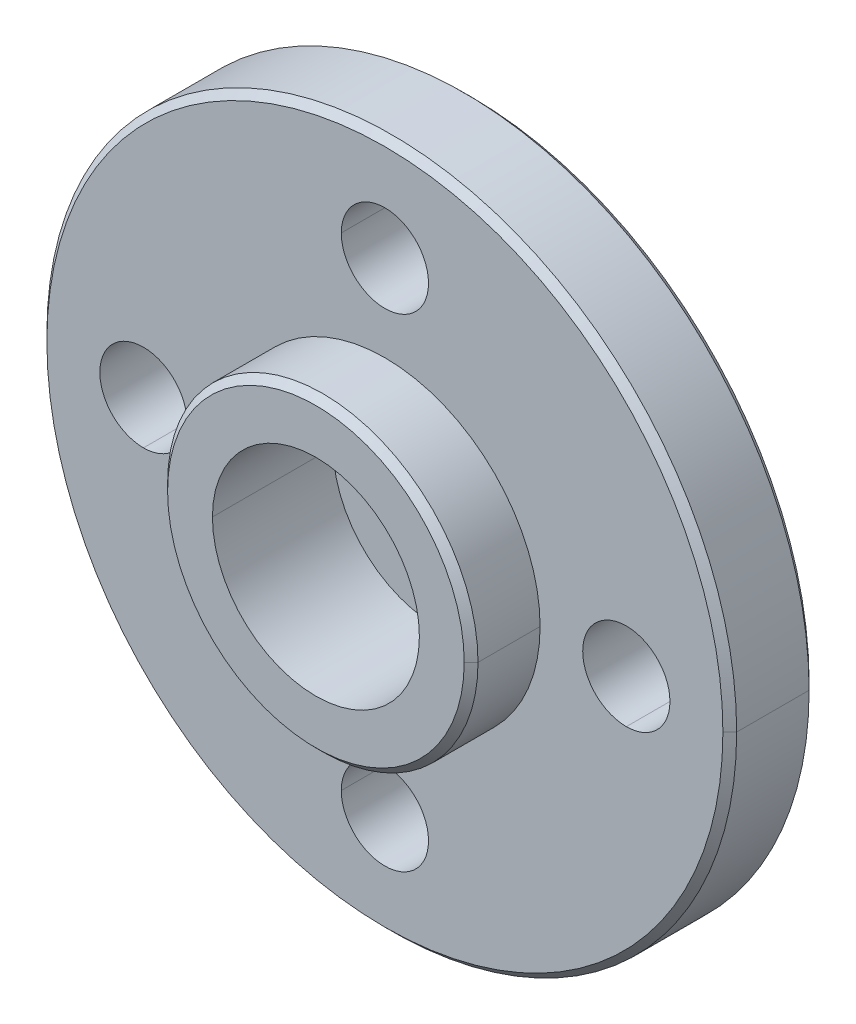
ISO-10303-21;
HEADER;
FILE_DESCRIPTION(('STEP AP214'),'2;1');
FILE_NAME('part.step','',(''),(''),'','','');
FILE_SCHEMA(('AUTOMOTIVE_DESIGN { 1 0 10303 214 1 1 1 1 }'));
ENDSEC;
DATA;
#1=APPLICATION_CONTEXT('core data for automotive mechanical design processes');
#2=APPLICATION_PROTOCOL_DEFINITION('international standard','automotive_design',2000,#1);
#3=PRODUCT_CONTEXT('',#1,'mechanical');
#4=PRODUCT('Part','Part','',(#3));
#5=PRODUCT_RELATED_PRODUCT_CATEGORY('part','',(#4));
#6=PRODUCT_DEFINITION_FORMATION('','',#4);
#7=PRODUCT_DEFINITION_CONTEXT('part definition',#1,'design');
#8=PRODUCT_DEFINITION('design','',#6,#7);
#9=PRODUCT_DEFINITION_SHAPE('','',#8);
#10=(LENGTH_UNIT() NAMED_UNIT(*) SI_UNIT(.MILLI.,.METRE.));
#11=(NAMED_UNIT(*) PLANE_ANGLE_UNIT() SI_UNIT($,.RADIAN.));
#12=(NAMED_UNIT(*) SI_UNIT($,.STERADIAN.) SOLID_ANGLE_UNIT());
#13=UNCERTAINTY_MEASURE_WITH_UNIT(LENGTH_MEASURE(1.E-05),#10,'distance_accuracy_value','');
#14=(GEOMETRIC_REPRESENTATION_CONTEXT(3) GLOBAL_UNCERTAINTY_ASSIGNED_CONTEXT((#13)) GLOBAL_UNIT_ASSIGNED_CONTEXT((#10,
#11,#12)) REPRESENTATION_CONTEXT('',''));
#15=CARTESIAN_POINT('',(0.,0.,0.));
#16=DIRECTION('',(0.,0.,1.));
#17=DIRECTION('',(1.,0.,0.));
#18=AXIS2_PLACEMENT_3D('',#15,#16,#17);
#19=CARTESIAN_POINT('',(0.,7.,-2.));
#20=DIRECTION('',(0.,0.,-1.));
#21=DIRECTION('',(0.,-1.,0.));
#22=AXIS2_PLACEMENT_3D('',#19,#20,#21);
#23=CYLINDRICAL_SURFACE('',#22,1.2645);
#24=CARTESIAN_POINT('',(0.,7.,2.5));
#25=DIRECTION('',(0.,0.,-1.));
#26=DIRECTION('',(1.,0.,0.));
#27=AXIS2_PLACEMENT_3D('',#24,#25,#26);
#28=CIRCLE('',#27,1.2645);
#29=CARTESIAN_POINT('',(-1.2645,7.,2.5));
#30=VERTEX_POINT('',#29);
#31=CARTESIAN_POINT('',(1.2645,7.,2.5));
#32=VERTEX_POINT('',#31);
#33=EDGE_CURVE('E11',#30,#32,#28,.T.);
#34=ORIENTED_EDGE('',*,*,#33,.F.);
#35=DIRECTION('',(0.,0.,-1.));
#36=VECTOR('',#35,1.);
#37=CARTESIAN_POINT('',(-1.2645,7.,-2.));
#38=LINE('',#37,#36);
#39=CARTESIAN_POINT('',(-1.2645,7.,0.));
#40=VERTEX_POINT('',#39);
#41=EDGE_CURVE('E25',#30,#40,#38,.T.);
#42=ORIENTED_EDGE('',*,*,#41,.T.);
#43=CARTESIAN_POINT('',(0.,7.,0.));
#44=DIRECTION('',(0.,0.,1.));
#45=DIRECTION('',(1.,0.,0.));
#46=AXIS2_PLACEMENT_3D('',#43,#44,#45);
#47=CIRCLE('',#46,1.2645);
#48=CARTESIAN_POINT('',(1.2645,7.,0.));
#49=VERTEX_POINT('',#48);
#50=EDGE_CURVE('E434',#49,#40,#47,.T.);
#51=ORIENTED_EDGE('',*,*,#50,.F.);
#52=DIRECTION('',(0.,0.,-1.));
#53=VECTOR('',#52,1.);
#54=CARTESIAN_POINT('',(1.2645,7.,-2.));
#55=LINE('',#54,#53);
#56=EDGE_CURVE('E429',#32,#49,#55,.T.);
#57=ORIENTED_EDGE('',*,*,#56,.F.);
#58=EDGE_LOOP('',(#34,#42,#51,#57));
#59=FACE_BOUND('',#58,.T.);
#60=ADVANCED_FACE('F17',(#59),#23,.F.);
#61=CARTESIAN_POINT('',(0.,7.,-2.));
#62=DIRECTION('',(0.,0.,-1.));
#63=DIRECTION('',(0.,1.,0.));
#64=AXIS2_PLACEMENT_3D('',#61,#62,#63);
#65=CYLINDRICAL_SURFACE('',#64,1.2645);
#66=ORIENTED_EDGE('',*,*,#41,.F.);
#67=CARTESIAN_POINT('',(0.,7.,2.5));
#68=DIRECTION('',(0.,0.,-1.));
#69=DIRECTION('',(1.,0.,0.));
#70=AXIS2_PLACEMENT_3D('',#67,#68,#69);
#71=CIRCLE('',#70,1.2645);
#72=EDGE_CURVE('E424',#32,#30,#71,.T.);
#73=ORIENTED_EDGE('',*,*,#72,.F.);
#74=ORIENTED_EDGE('',*,*,#56,.T.);
#75=CARTESIAN_POINT('',(0.,7.,0.));
#76=DIRECTION('',(0.,0.,1.));
#77=DIRECTION('',(1.,0.,0.));
#78=AXIS2_PLACEMENT_3D('',#75,#76,#77);
#79=CIRCLE('',#78,1.2645);
#80=EDGE_CURVE('E419',#40,#49,#79,.T.);
#81=ORIENTED_EDGE('',*,*,#80,.F.);
#82=EDGE_LOOP('',(#66,#73,#74,#81));
#83=FACE_BOUND('',#82,.T.);
#84=ADVANCED_FACE('F448',(#83),#65,.F.);
#85=CARTESIAN_POINT('',(0.,0.,0.));
#86=DIRECTION('',(0.,0.,1.));
#87=DIRECTION('',(1.,0.,0.));
#88=AXIS2_PLACEMENT_3D('',#85,#86,#87);
#89=PLANE('',#88);
#90=CARTESIAN_POINT('',(0.,0.,0.));
#91=DIRECTION('',(0.,0.,1.));
#92=DIRECTION('',(1.,0.,0.));
#93=AXIS2_PLACEMENT_3D('',#90,#91,#92);
#94=CIRCLE('',#93,9.8);
#95=CARTESIAN_POINT('',(9.8,0.,0.));
#96=VERTEX_POINT('',#95);
#97=CARTESIAN_POINT('',(-9.8,0.,0.));
#98=VERTEX_POINT('',#97);
#99=EDGE_CURVE('E415',#96,#98,#94,.T.);
#100=ORIENTED_EDGE('',*,*,#99,.F.);
#101=CARTESIAN_POINT('',(0.,0.,0.));
#102=DIRECTION('',(0.,0.,1.));
#103=DIRECTION('',(1.,0.,0.));
#104=AXIS2_PLACEMENT_3D('',#101,#102,#103);
#105=CIRCLE('',#104,9.8);
#106=EDGE_CURVE('E174',#98,#96,#105,.T.);
#107=ORIENTED_EDGE('',*,*,#106,.F.);
#108=EDGE_LOOP('',(#100,#107));
#109=FACE_BOUND('',#108,.T.);
#110=CARTESIAN_POINT('',(7.,0.,0.));
#111=DIRECTION('',(0.,0.,1.));
#112=DIRECTION('',(0.,-1.,0.));
#113=AXIS2_PLACEMENT_3D('',#110,#111,#112);
#114=CIRCLE('',#113,1.2645);
#115=CARTESIAN_POINT('',(7.,-1.2645,0.));
#116=VERTEX_POINT('',#115);
#117=CARTESIAN_POINT('',(7.,1.2645,0.));
#118=VERTEX_POINT('',#117);
#119=EDGE_CURVE('E408',#116,#118,#114,.T.);
#120=ORIENTED_EDGE('',*,*,#119,.T.);
#121=CARTESIAN_POINT('',(7.,0.,0.));
#122=DIRECTION('',(0.,0.,1.));
#123=DIRECTION('',(0.,-1.,0.));
#124=AXIS2_PLACEMENT_3D('',#121,#122,#123);
#125=CIRCLE('',#124,1.2645);
#126=EDGE_CURVE('E404',#118,#116,#125,.T.);
#127=ORIENTED_EDGE('',*,*,#126,.T.);
#128=EDGE_LOOP('',(#120,#127));
#129=FACE_BOUND('',#128,.T.);
#130=CARTESIAN_POINT('',(0.,-7.,0.));
#131=DIRECTION('',(0.,0.,1.));
#132=DIRECTION('',(-1.,0.,0.));
#133=AXIS2_PLACEMENT_3D('',#130,#131,#132);
#134=CIRCLE('',#133,1.2645);
#135=CARTESIAN_POINT('',(-1.2645,-7.,0.));
#136=VERTEX_POINT('',#135);
#137=CARTESIAN_POINT('',(1.2645,-7.,0.));
#138=VERTEX_POINT('',#137);
#139=EDGE_CURVE('E400',#136,#138,#134,.T.);
#140=ORIENTED_EDGE('',*,*,#139,.T.);
#141=CARTESIAN_POINT('',(0.,-7.,0.));
#142=DIRECTION('',(0.,0.,1.));
#143=DIRECTION('',(-1.,0.,0.));
#144=AXIS2_PLACEMENT_3D('',#141,#142,#143);
#145=CIRCLE('',#144,1.2645);
#146=EDGE_CURVE('E396',#138,#136,#145,.T.);
#147=ORIENTED_EDGE('',*,*,#146,.T.);
#148=EDGE_LOOP('',(#140,#147));
#149=FACE_BOUND('',#148,.T.);
#150=CARTESIAN_POINT('',(-7.,0.,0.));
#151=DIRECTION('',(0.,0.,1.));
#152=DIRECTION('',(0.,1.,0.));
#153=AXIS2_PLACEMENT_3D('',#150,#151,#152);
#154=CIRCLE('',#153,1.2645);
#155=CARTESIAN_POINT('',(-7.,1.2645,0.));
#156=VERTEX_POINT('',#155);
#157=CARTESIAN_POINT('',(-7.,-1.2645,0.));
#158=VERTEX_POINT('',#157);
#159=EDGE_CURVE('E392',#156,#158,#154,.T.);
#160=ORIENTED_EDGE('',*,*,#159,.T.);
#161=CARTESIAN_POINT('',(-7.,0.,0.));
#162=DIRECTION('',(0.,0.,1.));
#163=DIRECTION('',(0.,1.,0.));
#164=AXIS2_PLACEMENT_3D('',#161,#162,#163);
#165=CIRCLE('',#164,1.2645);
#166=EDGE_CURVE('E388',#158,#156,#165,.T.);
#167=ORIENTED_EDGE('',*,*,#166,.T.);
#168=EDGE_LOOP('',(#160,#167));
#169=FACE_BOUND('',#168,.T.);
#170=ORIENTED_EDGE('',*,*,#50,.T.);
#171=ORIENTED_EDGE('',*,*,#80,.T.);
#172=EDGE_LOOP('',(#170,#171));
#173=FACE_BOUND('',#172,.T.);
#174=CARTESIAN_POINT('',(0.,0.,0.));
#175=DIRECTION('',(0.,0.,-1.));
#176=DIRECTION('',(1.,0.,0.));
#177=AXIS2_PLACEMENT_3D('',#174,#175,#176);
#178=CIRCLE('',#177,1.7);
#179=CARTESIAN_POINT('',(1.7,0.,0.));
#180=VERTEX_POINT('',#179);
#181=CARTESIAN_POINT('',(-1.7,0.,0.));
#182=VERTEX_POINT('',#181);
#183=EDGE_CURVE('E383',#180,#182,#178,.T.);
#184=ORIENTED_EDGE('',*,*,#183,.F.);
#185=CARTESIAN_POINT('',(0.,0.,0.));
#186=DIRECTION('',(0.,0.,-1.));
#187=DIRECTION('',(1.,0.,0.));
#188=AXIS2_PLACEMENT_3D('',#185,#186,#187);
#189=CIRCLE('',#188,1.7);
#190=EDGE_CURVE('E378',#182,#180,#189,.T.);
#191=ORIENTED_EDGE('',*,*,#190,.F.);
#192=EDGE_LOOP('',(#184,#191));
#193=FACE_BOUND('',#192,.T.);
#194=ADVANCED_FACE('F444',(#109,#129,#149,#169,#173,#193),#89,.F.);
#195=CARTESIAN_POINT('',(0.,0.,0.1));
#196=DIRECTION('',(0.,0.,-1.));
#197=DIRECTION('',(0.,-1.,0.));
#198=AXIS2_PLACEMENT_3D('',#195,#196,#197);
#199=CONICAL_SURFACE('',#198,1.6,0.785398163397449);
#200=CARTESIAN_POINT('',(0.,0.,0.2));
#201=DIRECTION('',(0.,0.,1.));
#202=DIRECTION('',(1.,0.,0.));
#203=AXIS2_PLACEMENT_3D('',#200,#201,#202);
#204=CIRCLE('',#203,1.5);
#205=CARTESIAN_POINT('',(1.5,0.,0.2));
#206=VERTEX_POINT('',#205);
#207=CARTESIAN_POINT('',(-1.5,0.,0.2));
#208=VERTEX_POINT('',#207);
#209=EDGE_CURVE('E374',#206,#208,#204,.T.);
#210=ORIENTED_EDGE('',*,*,#209,.T.);
#211=DIRECTION('',(-0.707106781186548,0.,-0.707106781186547));
#212=VECTOR('',#211,1.);
#213=CARTESIAN_POINT('',(-1.6,0.,0.1));
#214=LINE('',#213,#212);
#215=EDGE_CURVE('E369',#208,#182,#214,.T.);
#216=ORIENTED_EDGE('',*,*,#215,.T.);
#217=ORIENTED_EDGE('',*,*,#190,.T.);
#218=DIRECTION('',(0.707106781186548,0.,-0.707106781186547));
#219=VECTOR('',#218,1.);
#220=CARTESIAN_POINT('',(1.6,0.,0.1));
#221=LINE('',#220,#219);
#222=EDGE_CURVE('E364',#206,#180,#221,.T.);
#223=ORIENTED_EDGE('',*,*,#222,.F.);
#224=EDGE_LOOP('',(#210,#216,#217,#223));
#225=FACE_BOUND('',#224,.T.);
#226=ADVANCED_FACE('F475',(#225),#199,.F.);
#227=CARTESIAN_POINT('',(0.,0.,0.1));
#228=DIRECTION('',(0.,0.,-1.));
#229=DIRECTION('',(0.,1.,0.));
#230=AXIS2_PLACEMENT_3D('',#227,#228,#229);
#231=CONICAL_SURFACE('',#230,1.6,0.785398163397449);
#232=ORIENTED_EDGE('',*,*,#215,.F.);
#233=CARTESIAN_POINT('',(0.,0.,0.2));
#234=DIRECTION('',(0.,0.,1.));
#235=DIRECTION('',(1.,0.,0.));
#236=AXIS2_PLACEMENT_3D('',#233,#234,#235);
#237=CIRCLE('',#236,1.5);
#238=EDGE_CURVE('E359',#208,#206,#237,.T.);
#239=ORIENTED_EDGE('',*,*,#238,.T.);
#240=ORIENTED_EDGE('',*,*,#222,.T.);
#241=ORIENTED_EDGE('',*,*,#183,.T.);
#242=EDGE_LOOP('',(#232,#239,#240,#241));
#243=FACE_BOUND('',#242,.T.);
#244=ADVANCED_FACE('F511',(#243),#231,.F.);
#245=CARTESIAN_POINT('',(0.,0.,1.));
#246=DIRECTION('',(0.,0.,-1.));
#247=DIRECTION('',(0.,1.,0.));
#248=AXIS2_PLACEMENT_3D('',#245,#246,#247);
#249=CYLINDRICAL_SURFACE('',#248,1.5);
#250=DIRECTION('',(0.,0.,-1.));
#251=VECTOR('',#250,1.);
#252=CARTESIAN_POINT('',(-1.5,0.,1.));
#253=LINE('',#252,#251);
#254=CARTESIAN_POINT('',(-1.5,0.,1.));
#255=VERTEX_POINT('',#254);
#256=EDGE_CURVE('E354',#255,#208,#253,.T.);
#257=ORIENTED_EDGE('',*,*,#256,.F.);
#258=CARTESIAN_POINT('',(0.,0.,1.));
#259=DIRECTION('',(0.,0.,-1.));
#260=DIRECTION('',(1.,0.,0.));
#261=AXIS2_PLACEMENT_3D('',#258,#259,#260);
#262=CIRCLE('',#261,1.5);
#263=CARTESIAN_POINT('',(1.5,0.,1.));
#264=VERTEX_POINT('',#263);
#265=EDGE_CURVE('E349',#264,#255,#262,.T.);
#266=ORIENTED_EDGE('',*,*,#265,.F.);
#267=DIRECTION('',(0.,0.,-1.));
#268=VECTOR('',#267,1.);
#269=CARTESIAN_POINT('',(1.5,0.,1.));
#270=LINE('',#269,#268);
#271=EDGE_CURVE('E344',#264,#206,#270,.T.);
#272=ORIENTED_EDGE('',*,*,#271,.T.);
#273=ORIENTED_EDGE('',*,*,#238,.F.);
#274=EDGE_LOOP('',(#257,#266,#272,#273));
#275=FACE_BOUND('',#274,.T.);
#276=ADVANCED_FACE('F515',(#275),#249,.F.);
#277=CARTESIAN_POINT('',(0.,0.,1.));
#278=DIRECTION('',(0.,0.,-1.));
#279=DIRECTION('',(0.,-1.,0.));
#280=AXIS2_PLACEMENT_3D('',#277,#278,#279);
#281=CYLINDRICAL_SURFACE('',#280,1.5);
#282=CARTESIAN_POINT('',(0.,0.,1.));
#283=DIRECTION('',(0.,0.,-1.));
#284=DIRECTION('',(1.,0.,0.));
#285=AXIS2_PLACEMENT_3D('',#282,#283,#284);
#286=CIRCLE('',#285,1.5);
#287=EDGE_CURVE('E339',#255,#264,#286,.T.);
#288=ORIENTED_EDGE('',*,*,#287,.F.);
#289=ORIENTED_EDGE('',*,*,#256,.T.);
#290=ORIENTED_EDGE('',*,*,#209,.F.);
#291=ORIENTED_EDGE('',*,*,#271,.F.);
#292=EDGE_LOOP('',(#288,#289,#290,#291));
#293=FACE_BOUND('',#292,.T.);
#294=ADVANCED_FACE('F519',(#293),#281,.F.);
#295=CARTESIAN_POINT('',(0.,0.,1.));
#296=DIRECTION('',(0.,0.,1.));
#297=DIRECTION('',(1.,0.,0.));
#298=AXIS2_PLACEMENT_3D('',#295,#296,#297);
#299=PLANE('',#298);
#300=CARTESIAN_POINT('',(0.,0.,1.));
#301=DIRECTION('',(0.,0.,-1.));
#302=DIRECTION('',(1.,0.,0.));
#303=AXIS2_PLACEMENT_3D('',#300,#301,#302);
#304=CIRCLE('',#303,3.);
#305=CARTESIAN_POINT('',(3.,0.,1.));
#306=VERTEX_POINT('',#305);
#307=CARTESIAN_POINT('',(-3.,0.,1.));
#308=VERTEX_POINT('',#307);
#309=EDGE_CURVE('E334',#306,#308,#304,.T.);
#310=ORIENTED_EDGE('',*,*,#309,.F.);
#311=CARTESIAN_POINT('',(0.,0.,1.));
#312=DIRECTION('',(0.,0.,-1.));
#313=DIRECTION('',(1.,0.,0.));
#314=AXIS2_PLACEMENT_3D('',#311,#312,#313);
#315=CIRCLE('',#314,3.);
#316=EDGE_CURVE('E329',#308,#306,#315,.T.);
#317=ORIENTED_EDGE('',*,*,#316,.F.);
#318=EDGE_LOOP('',(#310,#317));
#319=FACE_BOUND('',#318,.T.);
#320=ORIENTED_EDGE('',*,*,#265,.T.);
#321=ORIENTED_EDGE('',*,*,#287,.T.);
#322=EDGE_LOOP('',(#320,#321));
#323=FACE_BOUND('',#322,.T.);
#324=ADVANCED_FACE('F523',(#319,#323),#299,.T.);
#325=CARTESIAN_POINT('',(0.,0.,4.5));
#326=DIRECTION('',(0.,0.,-1.));
#327=DIRECTION('',(0.,-1.,0.));
#328=AXIS2_PLACEMENT_3D('',#325,#326,#327);
#329=CYLINDRICAL_SURFACE('',#328,3.);
#330=CARTESIAN_POINT('',(0.,0.,4.5));
#331=DIRECTION('',(0.,0.,-1.));
#332=DIRECTION('',(1.,0.,0.));
#333=AXIS2_PLACEMENT_3D('',#330,#331,#332);
#334=CIRCLE('',#333,3.);
#335=CARTESIAN_POINT('',(-3.,0.,4.5));
#336=VERTEX_POINT('',#335);
#337=CARTESIAN_POINT('',(3.,0.,4.5));
#338=VERTEX_POINT('',#337);
#339=EDGE_CURVE('E324',#336,#338,#334,.T.);
#340=ORIENTED_EDGE('',*,*,#339,.F.);
#341=DIRECTION('',(0.,0.,-1.));
#342=VECTOR('',#341,1.);
#343=CARTESIAN_POINT('',(-3.,0.,4.5));
#344=LINE('',#343,#342);
#345=EDGE_CURVE('E319',#336,#308,#344,.T.);
#346=ORIENTED_EDGE('',*,*,#345,.T.);
#347=ORIENTED_EDGE('',*,*,#316,.T.);
#348=DIRECTION('',(0.,0.,-1.));
#349=VECTOR('',#348,1.);
#350=CARTESIAN_POINT('',(3.,0.,4.5));
#351=LINE('',#350,#349);
#352=EDGE_CURVE('E314',#338,#306,#351,.T.);
#353=ORIENTED_EDGE('',*,*,#352,.F.);
#354=EDGE_LOOP('',(#340,#346,#347,#353));
#355=FACE_BOUND('',#354,.T.);
#356=ADVANCED_FACE('F527',(#355),#329,.F.);
#357=CARTESIAN_POINT('',(0.,0.,4.5));
#358=DIRECTION('',(0.,0.,-1.));
#359=DIRECTION('',(0.,1.,0.));
#360=AXIS2_PLACEMENT_3D('',#357,#358,#359);
#361=CYLINDRICAL_SURFACE('',#360,3.);
#362=ORIENTED_EDGE('',*,*,#345,.F.);
#363=CARTESIAN_POINT('',(0.,0.,4.5));
#364=DIRECTION('',(0.,0.,-1.));
#365=DIRECTION('',(1.,0.,0.));
#366=AXIS2_PLACEMENT_3D('',#363,#364,#365);
#367=CIRCLE('',#366,3.);
#368=EDGE_CURVE('E309',#338,#336,#367,.T.);
#369=ORIENTED_EDGE('',*,*,#368,.F.);
#370=ORIENTED_EDGE('',*,*,#352,.T.);
#371=ORIENTED_EDGE('',*,*,#309,.T.);
#372=EDGE_LOOP('',(#362,#369,#370,#371));
#373=FACE_BOUND('',#372,.T.);
#374=ADVANCED_FACE('F531',(#373),#361,.F.);
#375=CARTESIAN_POINT('',(0.,0.,4.5));
#376=DIRECTION('',(0.,0.,1.));
#377=DIRECTION('',(1.,0.,0.));
#378=AXIS2_PLACEMENT_3D('',#375,#376,#377);
#379=PLANE('',#378);
#380=CARTESIAN_POINT('',(0.,0.,4.5));
#381=DIRECTION('',(0.,0.,-1.));
#382=DIRECTION('',(1.,0.,0.));
#383=AXIS2_PLACEMENT_3D('',#380,#381,#382);
#384=CIRCLE('',#383,4.3);
#385=CARTESIAN_POINT('',(4.3,0.,4.5));
#386=VERTEX_POINT('',#385);
#387=CARTESIAN_POINT('',(-4.3,0.,4.5));
#388=VERTEX_POINT('',#387);
#389=EDGE_CURVE('E304',#386,#388,#384,.T.);
#390=ORIENTED_EDGE('',*,*,#389,.F.);
#391=CARTESIAN_POINT('',(0.,0.,4.5));
#392=DIRECTION('',(0.,0.,-1.));
#393=DIRECTION('',(1.,0.,0.));
#394=AXIS2_PLACEMENT_3D('',#391,#392,#393);
#395=CIRCLE('',#394,4.3);
#396=EDGE_CURVE('E299',#388,#386,#395,.T.);
#397=ORIENTED_EDGE('',*,*,#396,.F.);
#398=EDGE_LOOP('',(#390,#397));
#399=FACE_BOUND('',#398,.T.);
#400=ORIENTED_EDGE('',*,*,#368,.T.);
#401=ORIENTED_EDGE('',*,*,#339,.T.);
#402=EDGE_LOOP('',(#400,#401));
#403=FACE_BOUND('',#402,.T.);
#404=ADVANCED_FACE('F535',(#399,#403),#379,.T.);
#405=CARTESIAN_POINT('',(0.,0.,4.4));
#406=DIRECTION('',(0.,0.,-1.));
#407=DIRECTION('',(0.,-1.,0.));
#408=AXIS2_PLACEMENT_3D('',#405,#406,#407);
#409=CONICAL_SURFACE('',#408,4.4,0.785398163397448);
#410=DIRECTION('',(-0.707106781186547,0.,-0.707106781186548));
#411=VECTOR('',#410,1.);
#412=CARTESIAN_POINT('',(-4.4,0.,4.4));
#413=LINE('',#412,#411);
#414=CARTESIAN_POINT('',(-4.5,0.,4.3));
#415=VERTEX_POINT('',#414);
#416=EDGE_CURVE('E294',#388,#415,#413,.T.);
#417=ORIENTED_EDGE('',*,*,#416,.F.);
#418=ORIENTED_EDGE('',*,*,#396,.T.);
#419=DIRECTION('',(0.707106781186547,0.,-0.707106781186548));
#420=VECTOR('',#419,1.);
#421=CARTESIAN_POINT('',(4.4,0.,4.4));
#422=LINE('',#421,#420);
#423=CARTESIAN_POINT('',(4.5,0.,4.3));
#424=VERTEX_POINT('',#423);
#425=EDGE_CURVE('E290',#386,#424,#422,.T.);
#426=ORIENTED_EDGE('',*,*,#425,.T.);
#427=CARTESIAN_POINT('',(0.,0.,4.3));
#428=DIRECTION('',(0.,0.,1.));
#429=DIRECTION('',(1.,0.,0.));
#430=AXIS2_PLACEMENT_3D('',#427,#428,#429);
#431=CIRCLE('',#430,4.5);
#432=EDGE_CURVE('E286',#424,#415,#431,.T.);
#433=ORIENTED_EDGE('',*,*,#432,.T.);
#434=EDGE_LOOP('',(#417,#418,#426,#433));
#435=FACE_BOUND('',#434,.T.);
#436=ADVANCED_FACE('F539',(#435),#409,.T.);
#437=CARTESIAN_POINT('',(0.,0.,2.5));
#438=DIRECTION('',(0.,0.,1.));
#439=DIRECTION('',(0.,-1.,0.));
#440=AXIS2_PLACEMENT_3D('',#437,#438,#439);
#441=CYLINDRICAL_SURFACE('',#440,4.5);
#442=CARTESIAN_POINT('',(0.,0.,2.5));
#443=DIRECTION('',(0.,0.,-1.));
#444=DIRECTION('',(1.,0.,0.));
#445=AXIS2_PLACEMENT_3D('',#442,#443,#444);
#446=CIRCLE('',#445,4.5);
#447=CARTESIAN_POINT('',(-4.5,0.,2.5));
#448=VERTEX_POINT('',#447);
#449=CARTESIAN_POINT('',(4.5,0.,2.5));
#450=VERTEX_POINT('',#449);
#451=EDGE_CURVE('E281',#448,#450,#446,.T.);
#452=ORIENTED_EDGE('',*,*,#451,.F.);
#453=DIRECTION('',(0.,0.,1.));
#454=VECTOR('',#453,1.);
#455=CARTESIAN_POINT('',(-4.5,0.,2.5));
#456=LINE('',#455,#454);
#457=EDGE_CURVE('E276',#448,#415,#456,.T.);
#458=ORIENTED_EDGE('',*,*,#457,.T.);
#459=ORIENTED_EDGE('',*,*,#432,.F.);
#460=DIRECTION('',(0.,0.,1.));
#461=VECTOR('',#460,1.);
#462=CARTESIAN_POINT('',(4.5,0.,2.5));
#463=LINE('',#462,#461);
#464=EDGE_CURVE('E271',#450,#424,#463,.T.);
#465=ORIENTED_EDGE('',*,*,#464,.F.);
#466=EDGE_LOOP('',(#452,#458,#459,#465));
#467=FACE_BOUND('',#466,.T.);
#468=ADVANCED_FACE('F543',(#467),#441,.T.);
#469=CARTESIAN_POINT('',(0.,0.,2.5));
#470=DIRECTION('',(0.,0.,1.));
#471=DIRECTION('',(0.,1.,0.));
#472=AXIS2_PLACEMENT_3D('',#469,#470,#471);
#473=CYLINDRICAL_SURFACE('',#472,4.5);
#474=ORIENTED_EDGE('',*,*,#457,.F.);
#475=CARTESIAN_POINT('',(0.,0.,2.5));
#476=DIRECTION('',(0.,0.,-1.));
#477=DIRECTION('',(1.,0.,0.));
#478=AXIS2_PLACEMENT_3D('',#475,#476,#477);
#479=CIRCLE('',#478,4.5);
#480=EDGE_CURVE('E266',#450,#448,#479,.T.);
#481=ORIENTED_EDGE('',*,*,#480,.F.);
#482=ORIENTED_EDGE('',*,*,#464,.T.);
#483=CARTESIAN_POINT('',(0.,0.,4.3));
#484=DIRECTION('',(0.,0.,1.));
#485=DIRECTION('',(1.,0.,0.));
#486=AXIS2_PLACEMENT_3D('',#483,#484,#485);
#487=CIRCLE('',#486,4.5);
#488=EDGE_CURVE('E261',#415,#424,#487,.T.);
#489=ORIENTED_EDGE('',*,*,#488,.F.);
#490=EDGE_LOOP('',(#474,#481,#482,#489));
#491=FACE_BOUND('',#490,.T.);
#492=ADVANCED_FACE('F547',(#491),#473,.T.);
#493=CARTESIAN_POINT('',(0.,0.,4.4));
#494=DIRECTION('',(0.,0.,-1.));
#495=DIRECTION('',(0.,1.,0.));
#496=AXIS2_PLACEMENT_3D('',#493,#494,#495);
#497=CONICAL_SURFACE('',#496,4.4,0.785398163397448);
#498=ORIENTED_EDGE('',*,*,#389,.T.);
#499=ORIENTED_EDGE('',*,*,#416,.T.);
#500=ORIENTED_EDGE('',*,*,#488,.T.);
#501=ORIENTED_EDGE('',*,*,#425,.F.);
#502=EDGE_LOOP('',(#498,#499,#500,#501));
#503=FACE_BOUND('',#502,.T.);
#504=ADVANCED_FACE('F454',(#503),#497,.T.);
#505=CARTESIAN_POINT('',(0.,0.,2.5));
#506=DIRECTION('',(0.,0.,1.));
#507=DIRECTION('',(1.,0.,0.));
#508=AXIS2_PLACEMENT_3D('',#505,#506,#507);
#509=PLANE('',#508);
#510=CARTESIAN_POINT('',(0.,0.,2.5));
#511=DIRECTION('',(0.,0.,-1.));
#512=DIRECTION('',(1.,0.,0.));
#513=AXIS2_PLACEMENT_3D('',#510,#511,#512);
#514=CIRCLE('',#513,9.8);
#515=CARTESIAN_POINT('',(9.8,0.,2.5));
#516=VERTEX_POINT('',#515);
#517=CARTESIAN_POINT('',(-9.8,0.,2.5));
#518=VERTEX_POINT('',#517);
#519=EDGE_CURVE('E256',#516,#518,#514,.T.);
#520=ORIENTED_EDGE('',*,*,#519,.F.);
#521=CARTESIAN_POINT('',(0.,0.,2.5));
#522=DIRECTION('',(0.,0.,-1.));
#523=DIRECTION('',(1.,0.,0.));
#524=AXIS2_PLACEMENT_3D('',#521,#522,#523);
#525=CIRCLE('',#524,9.8);
#526=EDGE_CURVE('E251',#518,#516,#525,.T.);
#527=ORIENTED_EDGE('',*,*,#526,.F.);
#528=EDGE_LOOP('',(#520,#527));
#529=FACE_BOUND('',#528,.T.);
#530=ORIENTED_EDGE('',*,*,#480,.T.);
#531=ORIENTED_EDGE('',*,*,#451,.T.);
#532=EDGE_LOOP('',(#530,#531));
#533=FACE_BOUND('',#532,.T.);
#534=ORIENTED_EDGE('',*,*,#72,.T.);
#535=ORIENTED_EDGE('',*,*,#33,.T.);
#536=EDGE_LOOP('',(#534,#535));
#537=FACE_BOUND('',#536,.T.);
#538=CARTESIAN_POINT('',(-7.,0.,2.5));
#539=DIRECTION('',(0.,0.,-1.));
#540=DIRECTION('',(0.,1.,0.));
#541=AXIS2_PLACEMENT_3D('',#538,#539,#540);
#542=CIRCLE('',#541,1.2645);
#543=CARTESIAN_POINT('',(-7.,1.2645,2.5));
#544=VERTEX_POINT('',#543);
#545=CARTESIAN_POINT('',(-7.,-1.2645,2.5));
#546=VERTEX_POINT('',#545);
#547=EDGE_CURVE('E247',#544,#546,#542,.T.);
#548=ORIENTED_EDGE('',*,*,#547,.T.);
#549=CARTESIAN_POINT('',(-7.,0.,2.5));
#550=DIRECTION('',(0.,0.,-1.));
#551=DIRECTION('',(0.,1.,0.));
#552=AXIS2_PLACEMENT_3D('',#549,#550,#551);
#553=CIRCLE('',#552,1.2645);
#554=EDGE_CURVE('E243',#546,#544,#553,.T.);
#555=ORIENTED_EDGE('',*,*,#554,.T.);
#556=EDGE_LOOP('',(#548,#555));
#557=FACE_BOUND('',#556,.T.);
#558=CARTESIAN_POINT('',(0.,-7.,2.5));
#559=DIRECTION('',(0.,0.,-1.));
#560=DIRECTION('',(-1.,0.,0.));
#561=AXIS2_PLACEMENT_3D('',#558,#559,#560);
#562=CIRCLE('',#561,1.2645);
#563=CARTESIAN_POINT('',(-1.2645,-7.,2.5));
#564=VERTEX_POINT('',#563);
#565=CARTESIAN_POINT('',(1.2645,-7.,2.5));
#566=VERTEX_POINT('',#565);
#567=EDGE_CURVE('E239',#564,#566,#562,.T.);
#568=ORIENTED_EDGE('',*,*,#567,.T.);
#569=CARTESIAN_POINT('',(0.,-7.,2.5));
#570=DIRECTION('',(0.,0.,-1.));
#571=DIRECTION('',(-1.,0.,0.));
#572=AXIS2_PLACEMENT_3D('',#569,#570,#571);
#573=CIRCLE('',#572,1.2645);
#574=EDGE_CURVE('E235',#566,#564,#573,.T.);
#575=ORIENTED_EDGE('',*,*,#574,.T.);
#576=EDGE_LOOP('',(#568,#575));
#577=FACE_BOUND('',#576,.T.);
#578=CARTESIAN_POINT('',(7.,0.,2.5));
#579=DIRECTION('',(0.,0.,-1.));
#580=DIRECTION('',(0.,-1.,0.));
#581=AXIS2_PLACEMENT_3D('',#578,#579,#580);
#582=CIRCLE('',#581,1.2645);
#583=CARTESIAN_POINT('',(7.,-1.2645,2.5));
#584=VERTEX_POINT('',#583);
#585=CARTESIAN_POINT('',(7.,1.2645,2.5));
#586=VERTEX_POINT('',#585);
#587=EDGE_CURVE('E231',#584,#586,#582,.T.);
#588=ORIENTED_EDGE('',*,*,#587,.T.);
#589=CARTESIAN_POINT('',(7.,0.,2.5));
#590=DIRECTION('',(0.,0.,-1.));
#591=DIRECTION('',(0.,-1.,0.));
#592=AXIS2_PLACEMENT_3D('',#589,#590,#591);
#593=CIRCLE('',#592,1.2645);
#594=EDGE_CURVE('E227',#586,#584,#593,.T.);
#595=ORIENTED_EDGE('',*,*,#594,.T.);
#596=EDGE_LOOP('',(#588,#595));
#597=FACE_BOUND('',#596,.T.);
#598=ADVANCED_FACE('F450',(#529,#533,#537,#557,#577,#597),#509,.T.);
#599=CARTESIAN_POINT('',(7.,0.,-2.));
#600=DIRECTION('',(0.,0.,-1.));
#601=DIRECTION('',(-1.,0.,0.));
#602=AXIS2_PLACEMENT_3D('',#599,#600,#601);
#603=CYLINDRICAL_SURFACE('',#602,1.2645);
#604=ORIENTED_EDGE('',*,*,#594,.F.);
#605=DIRECTION('',(0.,0.,-1.));
#606=VECTOR('',#605,1.);
#607=CARTESIAN_POINT('',(7.,1.2645,-2.));
#608=LINE('',#607,#606);
#609=EDGE_CURVE('E222',#586,#118,#608,.T.);
#610=ORIENTED_EDGE('',*,*,#609,.T.);
#611=ORIENTED_EDGE('',*,*,#119,.F.);
#612=DIRECTION('',(0.,0.,-1.));
#613=VECTOR('',#612,1.);
#614=CARTESIAN_POINT('',(7.,-1.2645,-2.));
#615=LINE('',#614,#613);
#616=EDGE_CURVE('E217',#584,#116,#615,.T.);
#617=ORIENTED_EDGE('',*,*,#616,.F.);
#618=EDGE_LOOP('',(#604,#610,#611,#617));
#619=FACE_BOUND('',#618,.T.);
#620=ADVANCED_FACE('F453',(#619),#603,.F.);
#621=CARTESIAN_POINT('',(7.,0.,-2.));
#622=DIRECTION('',(0.,0.,-1.));
#623=DIRECTION('',(1.,0.,0.));
#624=AXIS2_PLACEMENT_3D('',#621,#622,#623);
#625=CYLINDRICAL_SURFACE('',#624,1.2645);
#626=ORIENTED_EDGE('',*,*,#609,.F.);
#627=ORIENTED_EDGE('',*,*,#587,.F.);
#628=ORIENTED_EDGE('',*,*,#616,.T.);
#629=ORIENTED_EDGE('',*,*,#126,.F.);
#630=EDGE_LOOP('',(#626,#627,#628,#629));
#631=FACE_BOUND('',#630,.T.);
#632=ADVANCED_FACE('F471',(#631),#625,.F.);
#633=CARTESIAN_POINT('',(0.,-7.,-2.));
#634=DIRECTION('',(0.,0.,-1.));
#635=DIRECTION('',(0.,1.,0.));
#636=AXIS2_PLACEMENT_3D('',#633,#634,#635);
#637=CYLINDRICAL_SURFACE('',#636,1.2645);
#638=ORIENTED_EDGE('',*,*,#574,.F.);
#639=DIRECTION('',(0.,0.,-1.));
#640=VECTOR('',#639,1.);
#641=CARTESIAN_POINT('',(1.2645,-7.,-2.));
#642=LINE('',#641,#640);
#643=EDGE_CURVE('E212',#566,#138,#642,.T.);
#644=ORIENTED_EDGE('',*,*,#643,.T.);
#645=ORIENTED_EDGE('',*,*,#139,.F.);
#646=DIRECTION('',(0.,0.,-1.));
#647=VECTOR('',#646,1.);
#648=CARTESIAN_POINT('',(-1.2645,-7.,-2.));
#649=LINE('',#648,#647);
#650=EDGE_CURVE('E207',#564,#136,#649,.T.);
#651=ORIENTED_EDGE('',*,*,#650,.F.);
#652=EDGE_LOOP('',(#638,#644,#645,#651));
#653=FACE_BOUND('',#652,.T.);
#654=ADVANCED_FACE('F499',(#653),#637,.F.);
#655=CARTESIAN_POINT('',(0.,-7.,-2.));
#656=DIRECTION('',(0.,0.,-1.));
#657=DIRECTION('',(0.,-1.,0.));
#658=AXIS2_PLACEMENT_3D('',#655,#656,#657);
#659=CYLINDRICAL_SURFACE('',#658,1.2645);
#660=ORIENTED_EDGE('',*,*,#643,.F.);
#661=ORIENTED_EDGE('',*,*,#567,.F.);
#662=ORIENTED_EDGE('',*,*,#650,.T.);
#663=ORIENTED_EDGE('',*,*,#146,.F.);
#664=EDGE_LOOP('',(#660,#661,#662,#663));
#665=FACE_BOUND('',#664,.T.);
#666=ADVANCED_FACE('F490',(#665),#659,.F.);
#667=CARTESIAN_POINT('',(-7.,0.,-2.));
#668=DIRECTION('',(0.,0.,-1.));
#669=DIRECTION('',(1.,0.,0.));
#670=AXIS2_PLACEMENT_3D('',#667,#668,#669);
#671=CYLINDRICAL_SURFACE('',#670,1.2645);
#672=ORIENTED_EDGE('',*,*,#554,.F.);
#673=DIRECTION('',(0.,0.,-1.));
#674=VECTOR('',#673,1.);
#675=CARTESIAN_POINT('',(-7.,-1.2645,-2.));
#676=LINE('',#675,#674);
#677=EDGE_CURVE('E202',#546,#158,#676,.T.);
#678=ORIENTED_EDGE('',*,*,#677,.T.);
#679=ORIENTED_EDGE('',*,*,#159,.F.);
#680=DIRECTION('',(0.,0.,-1.));
#681=VECTOR('',#680,1.);
#682=CARTESIAN_POINT('',(-7.,1.2645,-2.));
#683=LINE('',#682,#681);
#684=EDGE_CURVE('E197',#544,#156,#683,.T.);
#685=ORIENTED_EDGE('',*,*,#684,.F.);
#686=EDGE_LOOP('',(#672,#678,#679,#685));
#687=FACE_BOUND('',#686,.T.);
#688=ADVANCED_FACE('F488',(#687),#671,.F.);
#689=CARTESIAN_POINT('',(-7.,0.,-2.));
#690=DIRECTION('',(0.,0.,-1.));
#691=DIRECTION('',(-1.,0.,0.));
#692=AXIS2_PLACEMENT_3D('',#689,#690,#691);
#693=CYLINDRICAL_SURFACE('',#692,1.2645);
#694=ORIENTED_EDGE('',*,*,#677,.F.);
#695=ORIENTED_EDGE('',*,*,#547,.F.);
#696=ORIENTED_EDGE('',*,*,#684,.T.);
#697=ORIENTED_EDGE('',*,*,#166,.F.);
#698=EDGE_LOOP('',(#694,#695,#696,#697));
#699=FACE_BOUND('',#698,.T.);
#700=ADVANCED_FACE('F487',(#699),#693,.F.);
#701=CARTESIAN_POINT('',(0.,0.,2.4));
#702=DIRECTION('',(0.,0.,-1.));
#703=DIRECTION('',(0.,-1.,0.));
#704=AXIS2_PLACEMENT_3D('',#701,#702,#703);
#705=CONICAL_SURFACE('',#704,9.9,0.785398163397448);
#706=DIRECTION('',(-0.707106781186547,0.,-0.707106781186548));
#707=VECTOR('',#706,1.);
#708=CARTESIAN_POINT('',(-9.9,0.,2.4));
#709=LINE('',#708,#707);
#710=CARTESIAN_POINT('',(-10.,0.,2.3));
#711=VERTEX_POINT('',#710);
#712=EDGE_CURVE('E192',#518,#711,#709,.T.);
#713=ORIENTED_EDGE('',*,*,#712,.F.);
#714=ORIENTED_EDGE('',*,*,#526,.T.);
#715=DIRECTION('',(0.707106781186547,0.,-0.707106781186548));
#716=VECTOR('',#715,1.);
#717=CARTESIAN_POINT('',(9.9,0.,2.4));
#718=LINE('',#717,#716);
#719=CARTESIAN_POINT('',(10.,0.,2.3));
#720=VERTEX_POINT('',#719);
#721=EDGE_CURVE('E181',#516,#720,#718,.T.);
#722=ORIENTED_EDGE('',*,*,#721,.T.);
#723=CARTESIAN_POINT('',(0.,0.,2.3));
#724=DIRECTION('',(0.,0.,1.));
#725=DIRECTION('',(1.,0.,0.));
#726=AXIS2_PLACEMENT_3D('',#723,#724,#725);
#727=CIRCLE('',#726,10.);
#728=EDGE_CURVE('E156',#720,#711,#727,.T.);
#729=ORIENTED_EDGE('',*,*,#728,.T.);
#730=EDGE_LOOP('',(#713,#714,#722,#729));
#731=FACE_BOUND('',#730,.T.);
#732=ADVANCED_FACE('F497',(#731),#705,.T.);
#733=CARTESIAN_POINT('',(0.,0.,0.));
#734=DIRECTION('',(0.,0.,1.));
#735=DIRECTION('',(0.,-1.,0.));
#736=AXIS2_PLACEMENT_3D('',#733,#734,#735);
#737=CYLINDRICAL_SURFACE('',#736,10.);
#738=CARTESIAN_POINT('',(0.,0.,0.2));
#739=DIRECTION('',(0.,0.,-1.));
#740=DIRECTION('',(1.,0.,0.));
#741=AXIS2_PLACEMENT_3D('',#738,#739,#740);
#742=CIRCLE('',#741,10.);
#743=CARTESIAN_POINT('',(-10.,0.,0.2));
#744=VERTEX_POINT('',#743);
#745=CARTESIAN_POINT('',(10.,0.,0.2));
#746=VERTEX_POINT('',#745);
#747=EDGE_CURVE('E154',#744,#746,#742,.T.);
#748=ORIENTED_EDGE('',*,*,#747,.F.);
#749=DIRECTION('',(0.,0.,1.));
#750=VECTOR('',#749,1.);
#751=CARTESIAN_POINT('',(-10.,0.,0.));
#752=LINE('',#751,#750);
#753=EDGE_CURVE('E159',#744,#711,#752,.T.);
#754=ORIENTED_EDGE('',*,*,#753,.T.);
#755=ORIENTED_EDGE('',*,*,#728,.F.);
#756=DIRECTION('',(0.,0.,1.));
#757=VECTOR('',#756,1.);
#758=CARTESIAN_POINT('',(10.,0.,0.));
#759=LINE('',#758,#757);
#760=EDGE_CURVE('E149',#746,#720,#759,.T.);
#761=ORIENTED_EDGE('',*,*,#760,.F.);
#762=EDGE_LOOP('',(#748,#754,#755,#761));
#763=FACE_BOUND('',#762,.T.);
#764=ADVANCED_FACE('F151',(#763),#737,.T.);
#765=CARTESIAN_POINT('',(0.,0.,0.));
#766=DIRECTION('',(0.,0.,1.));
#767=DIRECTION('',(0.,1.,0.));
#768=AXIS2_PLACEMENT_3D('',#765,#766,#767);
#769=CYLINDRICAL_SURFACE('',#768,10.);
#770=ORIENTED_EDGE('',*,*,#753,.F.);
#771=CARTESIAN_POINT('',(0.,0.,0.2));
#772=DIRECTION('',(0.,0.,-1.));
#773=DIRECTION('',(1.,0.,0.));
#774=AXIS2_PLACEMENT_3D('',#771,#772,#773);
#775=CIRCLE('',#774,10.);
#776=EDGE_CURVE('E160',#746,#744,#775,.T.);
#777=ORIENTED_EDGE('',*,*,#776,.F.);
#778=ORIENTED_EDGE('',*,*,#760,.T.);
#779=CARTESIAN_POINT('',(0.,0.,2.3));
#780=DIRECTION('',(0.,0.,1.));
#781=DIRECTION('',(1.,0.,0.));
#782=AXIS2_PLACEMENT_3D('',#779,#780,#781);
#783=CIRCLE('',#782,10.);
#784=EDGE_CURVE('E168',#711,#720,#783,.T.);
#785=ORIENTED_EDGE('',*,*,#784,.F.);
#786=EDGE_LOOP('',(#770,#777,#778,#785));
#787=FACE_BOUND('',#786,.T.);
#788=ADVANCED_FACE('F164',(#787),#769,.T.);
#789=CARTESIAN_POINT('',(0.,0.,2.4));
#790=DIRECTION('',(0.,0.,-1.));
#791=DIRECTION('',(0.,1.,0.));
#792=AXIS2_PLACEMENT_3D('',#789,#790,#791);
#793=CONICAL_SURFACE('',#792,9.9,0.785398163397448);
#794=ORIENTED_EDGE('',*,*,#519,.T.);
#795=ORIENTED_EDGE('',*,*,#712,.T.);
#796=ORIENTED_EDGE('',*,*,#784,.T.);
#797=ORIENTED_EDGE('',*,*,#721,.F.);
#798=EDGE_LOOP('',(#794,#795,#796,#797));
#799=FACE_BOUND('',#798,.T.);
#800=ADVANCED_FACE('F612',(#799),#793,.T.);
#801=CARTESIAN_POINT('',(0.,0.,0.1));
#802=DIRECTION('',(0.,0.,1.));
#803=DIRECTION('',(0.,1.,0.));
#804=AXIS2_PLACEMENT_3D('',#801,#802,#803);
#805=CONICAL_SURFACE('',#804,9.9,0.785398163397449);
#806=DIRECTION('',(-0.707106781186548,0.,0.707106781186547));
#807=VECTOR('',#806,1.);
#808=CARTESIAN_POINT('',(-9.9,0.,0.1));
#809=LINE('',#808,#807);
#810=EDGE_CURVE('E177',#98,#744,#809,.T.);
#811=ORIENTED_EDGE('',*,*,#810,.F.);
#812=ORIENTED_EDGE('',*,*,#106,.T.);
#813=DIRECTION('',(0.707106781186548,0.,0.707106781186547));
#814=VECTOR('',#813,1.);
#815=CARTESIAN_POINT('',(9.9,0.,0.1));
#816=LINE('',#815,#814);
#817=EDGE_CURVE('E172',#96,#746,#816,.T.);
#818=ORIENTED_EDGE('',*,*,#817,.T.);
#819=ORIENTED_EDGE('',*,*,#776,.T.);
#820=EDGE_LOOP('',(#811,#812,#818,#819));
#821=FACE_BOUND('',#820,.T.);
#822=ADVANCED_FACE('F173',(#821),#805,.T.);
#823=CARTESIAN_POINT('',(0.,0.,0.1));
#824=DIRECTION('',(0.,0.,1.));
#825=DIRECTION('',(0.,-1.,0.));
#826=AXIS2_PLACEMENT_3D('',#823,#824,#825);
#827=CONICAL_SURFACE('',#826,9.9,0.785398163397449);
#828=ORIENTED_EDGE('',*,*,#99,.T.);
#829=ORIENTED_EDGE('',*,*,#810,.T.);
#830=ORIENTED_EDGE('',*,*,#747,.T.);
#831=ORIENTED_EDGE('',*,*,#817,.F.);
#832=EDGE_LOOP('',(#828,#829,#830,#831));
#833=FACE_BOUND('',#832,.T.);
#834=ADVANCED_FACE('F179',(#833),#827,.T.);
#835=CLOSED_SHELL('',(#60,#84,#194,#226,#244,#276,#294,#324,#356,#374,#404,#436,#468,#492,#504,
#598,#620,#632,#654,#666,#688,#700,#732,#764,#788,#800,#822,#834));
#836=MANIFOLD_SOLID_BREP('B1',#835);
#837=ADVANCED_BREP_SHAPE_REPRESENTATION('',(#18,#836),#14);
#838=SHAPE_DEFINITION_REPRESENTATION(#9,#837);
ENDSEC;
END-ISO-10303-21;
